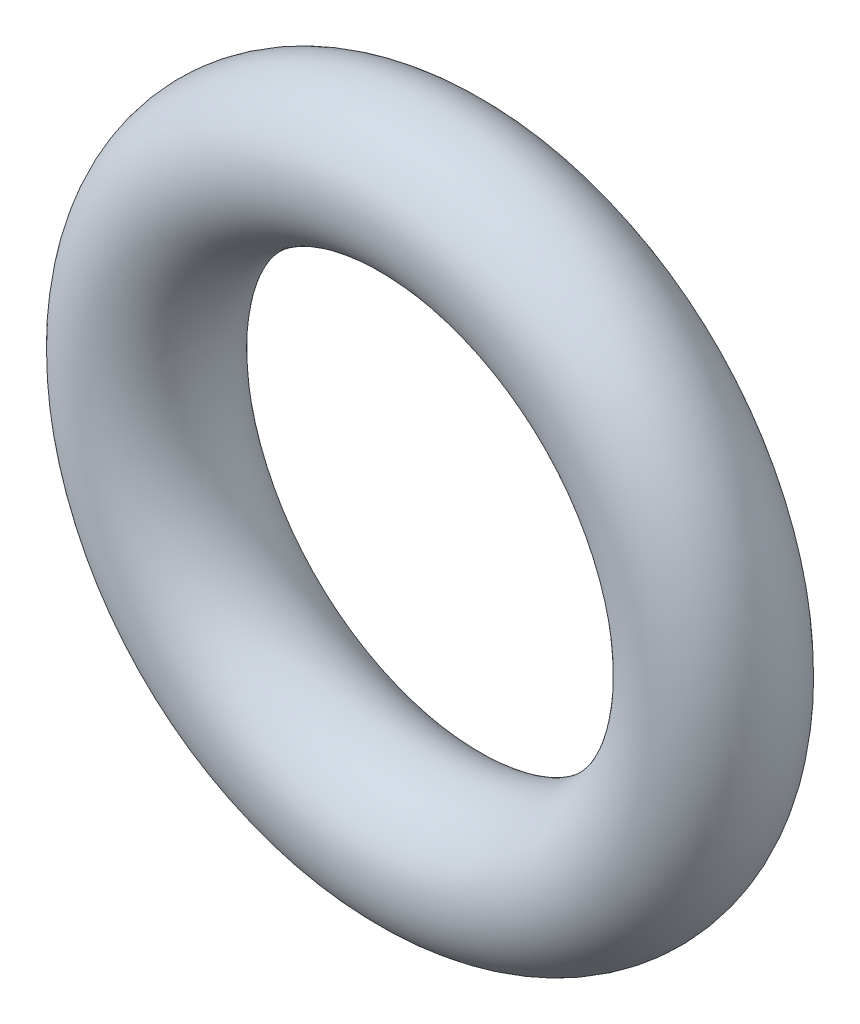
ISO-10303-21;
HEADER;
FILE_DESCRIPTION(('STEP AP214'),'2;1');
FILE_NAME('part.step','',(''),(''),'','','');
FILE_SCHEMA(('AUTOMOTIVE_DESIGN { 1 0 10303 214 1 1 1 1 }'));
ENDSEC;
DATA;
#1=APPLICATION_CONTEXT('core data for automotive mechanical design processes');
#2=APPLICATION_PROTOCOL_DEFINITION('international standard','automotive_design',2000,#1);
#3=PRODUCT_CONTEXT('',#1,'mechanical');
#4=PRODUCT('Part','Part','',(#3));
#5=PRODUCT_RELATED_PRODUCT_CATEGORY('part','',(#4));
#6=PRODUCT_DEFINITION_FORMATION('','',#4);
#7=PRODUCT_DEFINITION_CONTEXT('part definition',#1,'design');
#8=PRODUCT_DEFINITION('design','',#6,#7);
#9=PRODUCT_DEFINITION_SHAPE('','',#8);
#10=(LENGTH_UNIT() NAMED_UNIT(*) SI_UNIT(.MILLI.,.METRE.));
#11=(NAMED_UNIT(*) PLANE_ANGLE_UNIT() SI_UNIT($,.RADIAN.));
#12=(NAMED_UNIT(*) SI_UNIT($,.STERADIAN.) SOLID_ANGLE_UNIT());
#13=UNCERTAINTY_MEASURE_WITH_UNIT(LENGTH_MEASURE(1.E-05),#10,'distance_accuracy_value','');
#14=(GEOMETRIC_REPRESENTATION_CONTEXT(3) GLOBAL_UNCERTAINTY_ASSIGNED_CONTEXT((#13)) GLOBAL_UNIT_ASSIGNED_CONTEXT((#10,
#11,#12)) REPRESENTATION_CONTEXT('',''));
#15=CARTESIAN_POINT('',(0.,0.,0.));
#16=DIRECTION('',(0.,0.,1.));
#17=DIRECTION('',(1.,0.,0.));
#18=AXIS2_PLACEMENT_3D('',#15,#16,#17);
#19=CARTESIAN_POINT('',(0.,0.,0.));
#20=DIRECTION('',(0.,0.,-1.));
#21=DIRECTION('',(-1.,0.,0.));
#22=AXIS2_PLACEMENT_3D('',#19,#20,#21);
#23=TOROIDAL_SURFACE('',#22,20.,5.);
#24=CARTESIAN_POINT('',(-25.,0.,0.));
#25=VERTEX_POINT('',#24);
#26=VERTEX_LOOP('',#25);
#27=FACE_BOUND('',#26,.T.);
#28=ADVANCED_FACE('F39',(#27),#23,.T.);
#29=CLOSED_SHELL('',(#28));
#30=MANIFOLD_SOLID_BREP('B2',#29);
#31=ADVANCED_BREP_SHAPE_REPRESENTATION('',(#18,#30),#14);
#32=SHAPE_DEFINITION_REPRESENTATION(#9,#31);
ENDSEC;
END-ISO-10303-21;
